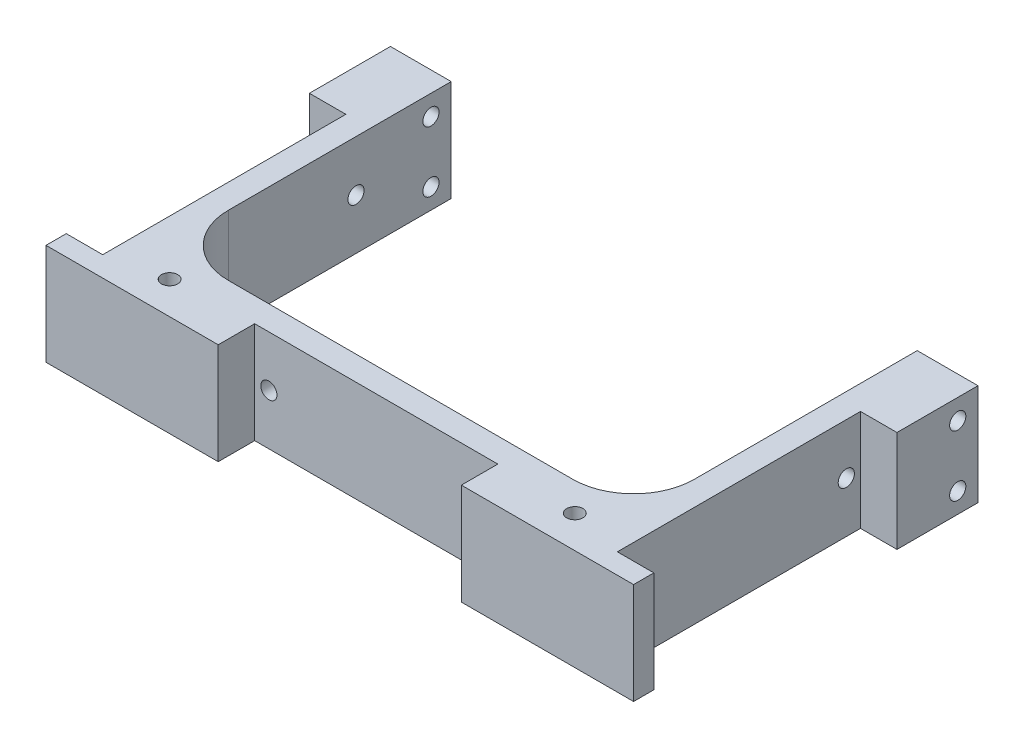
ISO-10303-21;
HEADER;
FILE_DESCRIPTION(('STEP AP214'),'2;1');
FILE_NAME('part.step','',(''),(''),'','','');
FILE_SCHEMA(('AUTOMOTIVE_DESIGN { 1 0 10303 214 1 1 1 1 }'));
ENDSEC;
DATA;
#1=APPLICATION_CONTEXT('core data for automotive mechanical design processes');
#2=APPLICATION_PROTOCOL_DEFINITION('international standard','automotive_design',2000,#1);
#3=PRODUCT_CONTEXT('',#1,'mechanical');
#4=PRODUCT('Part','Part','',(#3));
#5=PRODUCT_RELATED_PRODUCT_CATEGORY('part','',(#4));
#6=PRODUCT_DEFINITION_FORMATION('','',#4);
#7=PRODUCT_DEFINITION_CONTEXT('part definition',#1,'design');
#8=PRODUCT_DEFINITION('design','',#6,#7);
#9=PRODUCT_DEFINITION_SHAPE('','',#8);
#10=(LENGTH_UNIT() NAMED_UNIT(*) SI_UNIT(.MILLI.,.METRE.));
#11=(NAMED_UNIT(*) PLANE_ANGLE_UNIT() SI_UNIT($,.RADIAN.));
#12=(NAMED_UNIT(*) SI_UNIT($,.STERADIAN.) SOLID_ANGLE_UNIT());
#13=UNCERTAINTY_MEASURE_WITH_UNIT(LENGTH_MEASURE(1.E-05),#10,'distance_accuracy_value','');
#14=(GEOMETRIC_REPRESENTATION_CONTEXT(3) GLOBAL_UNCERTAINTY_ASSIGNED_CONTEXT((#13)) GLOBAL_UNIT_ASSIGNED_CONTEXT((#10,
#11,#12)) REPRESENTATION_CONTEXT('',''));
#15=CARTESIAN_POINT('',(0.,0.,0.));
#16=DIRECTION('',(0.,0.,1.));
#17=DIRECTION('',(1.,0.,0.));
#18=AXIS2_PLACEMENT_3D('',#15,#16,#17);
#19=CARTESIAN_POINT('',(63.5,25.,0.));
#20=DIRECTION('',(1.,0.,0.));
#21=DIRECTION('',(0.,0.,-1.));
#22=AXIS2_PLACEMENT_3D('',#19,#20,#21);
#23=PLANE('',#22);
#24=CARTESIAN_POINT('',(63.5,12.5,41.5));
#25=DIRECTION('',(1.,0.,0.));
#26=DIRECTION('',(0.,0.,-1.));
#27=AXIS2_PLACEMENT_3D('',#24,#25,#26);
#28=CIRCLE('',#27,2.);
#29=CARTESIAN_POINT('',(63.5,12.5,39.5));
#30=VERTEX_POINT('',#29);
#31=EDGE_CURVE('E597',#30,#30,#28,.T.);
#32=ORIENTED_EDGE('',*,*,#31,.F.);
#33=EDGE_LOOP('',(#32));
#34=FACE_BOUND('',#33,.T.);
#35=CARTESIAN_POINT('',(63.5,12.5,-11.5));
#36=DIRECTION('',(1.,0.,0.));
#37=DIRECTION('',(0.,0.,-1.));
#38=AXIS2_PLACEMENT_3D('',#35,#36,#37);
#39=CIRCLE('',#38,2.);
#40=CARTESIAN_POINT('',(63.5,12.5,-13.5));
#41=VERTEX_POINT('',#40);
#42=EDGE_CURVE('E594',#41,#41,#39,.T.);
#43=ORIENTED_EDGE('',*,*,#42,.F.);
#44=EDGE_LOOP('',(#43));
#45=FACE_BOUND('',#44,.T.);
#46=DIRECTION('',(0.,0.,1.));
#47=VECTOR('',#46,1.);
#48=CARTESIAN_POINT('',(63.5,0.,0.));
#49=LINE('',#48,#47);
#50=CARTESIAN_POINT('',(63.5,0.,-15.));
#51=VERTEX_POINT('',#50);
#52=CARTESIAN_POINT('',(63.5,0.,45.));
#53=VERTEX_POINT('',#52);
#54=EDGE_CURVE('E187',#51,#53,#49,.T.);
#55=ORIENTED_EDGE('',*,*,#54,.F.);
#56=DIRECTION('',(0.,-1.,0.));
#57=VECTOR('',#56,1.);
#58=CARTESIAN_POINT('',(63.5,25.,-15.));
#59=LINE('',#58,#57);
#60=CARTESIAN_POINT('',(63.5,25.,-15.));
#61=VERTEX_POINT('',#60);
#62=EDGE_CURVE('E183',#61,#51,#59,.T.);
#63=ORIENTED_EDGE('',*,*,#62,.F.);
#64=DIRECTION('',(0.,0.,1.));
#65=VECTOR('',#64,1.);
#66=CARTESIAN_POINT('',(63.5,25.,0.));
#67=LINE('',#66,#65);
#68=CARTESIAN_POINT('',(63.5,25.,45.));
#69=VERTEX_POINT('',#68);
#70=EDGE_CURVE('E185',#61,#69,#67,.T.);
#71=ORIENTED_EDGE('',*,*,#70,.T.);
#72=DIRECTION('',(0.,-1.,0.));
#73=VECTOR('',#72,1.);
#74=CARTESIAN_POINT('',(63.5,25.,45.));
#75=LINE('',#74,#73);
#76=EDGE_CURVE('E247',#69,#53,#75,.T.);
#77=ORIENTED_EDGE('',*,*,#76,.T.);
#78=EDGE_LOOP('',(#55,#63,#71,#77));
#79=FACE_BOUND('',#78,.T.);
#80=ADVANCED_FACE('F34',(#34,#45,#79),#23,.T.);
#81=CARTESIAN_POINT('',(0.,25.,-15.));
#82=DIRECTION('',(0.,0.,1.));
#83=DIRECTION('',(1.,0.,0.));
#84=AXIS2_PLACEMENT_3D('',#81,#82,#83);
#85=PLANE('',#84);
#86=DIRECTION('',(-1.,0.,0.));
#87=VECTOR('',#86,1.);
#88=CARTESIAN_POINT('',(0.,0.,-15.));
#89=LINE('',#88,#87);
#90=CARTESIAN_POINT('',(72.5,0.,-15.));
#91=VERTEX_POINT('',#90);
#92=EDGE_CURVE('E249',#91,#51,#89,.T.);
#93=ORIENTED_EDGE('',*,*,#92,.F.);
#94=DIRECTION('',(0.,-1.,0.));
#95=VECTOR('',#94,1.);
#96=CARTESIAN_POINT('',(72.5,25.,-15.));
#97=LINE('',#96,#95);
#98=CARTESIAN_POINT('',(72.5,25.,-15.));
#99=VERTEX_POINT('',#98);
#100=EDGE_CURVE('E193',#99,#91,#97,.T.);
#101=ORIENTED_EDGE('',*,*,#100,.F.);
#102=DIRECTION('',(-1.,0.,0.));
#103=VECTOR('',#102,1.);
#104=CARTESIAN_POINT('',(0.,25.,-15.));
#105=LINE('',#104,#103);
#106=EDGE_CURVE('E197',#99,#61,#105,.T.);
#107=ORIENTED_EDGE('',*,*,#106,.T.);
#108=ORIENTED_EDGE('',*,*,#62,.T.);
#109=EDGE_LOOP('',(#93,#101,#107,#108));
#110=FACE_BOUND('',#109,.T.);
#111=ADVANCED_FACE('F203',(#110),#85,.T.);
#112=CARTESIAN_POINT('',(72.5,25.,0.));
#113=DIRECTION('',(-1.,0.,0.));
#114=DIRECTION('',(0.,0.,1.));
#115=AXIS2_PLACEMENT_3D('',#112,#113,#114);
#116=PLANE('',#115);
#117=CARTESIAN_POINT('',(72.5,20.,-30.));
#118=DIRECTION('',(-1.,0.,0.));
#119=DIRECTION('',(0.,0.,1.));
#120=AXIS2_PLACEMENT_3D('',#117,#118,#119);
#121=CIRCLE('',#120,2.);
#122=CARTESIAN_POINT('',(72.5,20.,-28.));
#123=VERTEX_POINT('',#122);
#124=EDGE_CURVE('E571',#123,#123,#121,.T.);
#125=ORIENTED_EDGE('',*,*,#124,.T.);
#126=EDGE_LOOP('',(#125));
#127=FACE_BOUND('',#126,.T.);
#128=CARTESIAN_POINT('',(72.5,5.,-30.));
#129=DIRECTION('',(-1.,0.,0.));
#130=DIRECTION('',(0.,0.,1.));
#131=AXIS2_PLACEMENT_3D('',#128,#129,#130);
#132=CIRCLE('',#131,2.);
#133=CARTESIAN_POINT('',(72.5,5.,-28.));
#134=VERTEX_POINT('',#133);
#135=EDGE_CURVE('E578',#134,#134,#132,.T.);
#136=ORIENTED_EDGE('',*,*,#135,.T.);
#137=EDGE_LOOP('',(#136));
#138=FACE_BOUND('',#137,.T.);
#139=DIRECTION('',(0.,0.,-1.));
#140=VECTOR('',#139,1.);
#141=CARTESIAN_POINT('',(72.5,0.,0.));
#142=LINE('',#141,#140);
#143=CARTESIAN_POINT('',(72.5,0.,-35.));
#144=VERTEX_POINT('',#143);
#145=EDGE_CURVE('E252',#91,#144,#142,.T.);
#146=ORIENTED_EDGE('',*,*,#145,.T.);
#147=DIRECTION('',(0.,-1.,0.));
#148=VECTOR('',#147,1.);
#149=CARTESIAN_POINT('',(72.5,25.,-35.));
#150=LINE('',#149,#148);
#151=CARTESIAN_POINT('',(72.5,25.,-35.));
#152=VERTEX_POINT('',#151);
#153=EDGE_CURVE('E334',#152,#144,#150,.T.);
#154=ORIENTED_EDGE('',*,*,#153,.F.);
#155=DIRECTION('',(0.,0.,-1.));
#156=VECTOR('',#155,1.);
#157=CARTESIAN_POINT('',(72.5,25.,0.));
#158=LINE('',#157,#156);
#159=EDGE_CURVE('E205',#99,#152,#158,.T.);
#160=ORIENTED_EDGE('',*,*,#159,.F.);
#161=ORIENTED_EDGE('',*,*,#100,.T.);
#162=EDGE_LOOP('',(#146,#154,#160,#161));
#163=FACE_BOUND('',#162,.T.);
#164=ADVANCED_FACE('F427',(#127,#138,#163),#116,.F.);
#165=CARTESIAN_POINT('',(0.,25.,-35.));
#166=DIRECTION('',(0.,0.,-1.));
#167=DIRECTION('',(-1.,0.,0.));
#168=AXIS2_PLACEMENT_3D('',#165,#166,#167);
#169=PLANE('',#168);
#170=DIRECTION('',(1.,0.,0.));
#171=VECTOR('',#170,1.);
#172=CARTESIAN_POINT('',(0.,0.,-35.));
#173=LINE('',#172,#171);
#174=CARTESIAN_POINT('',(57.5,0.,-35.));
#175=VERTEX_POINT('',#174);
#176=EDGE_CURVE('E255',#175,#144,#173,.T.);
#177=ORIENTED_EDGE('',*,*,#176,.F.);
#178=DIRECTION('',(0.,-1.,0.));
#179=VECTOR('',#178,1.);
#180=CARTESIAN_POINT('',(57.5,25.,-35.));
#181=LINE('',#180,#179);
#182=CARTESIAN_POINT('',(57.5,25.,-35.));
#183=VERTEX_POINT('',#182);
#184=EDGE_CURVE('E331',#183,#175,#181,.T.);
#185=ORIENTED_EDGE('',*,*,#184,.F.);
#186=DIRECTION('',(1.,0.,0.));
#187=VECTOR('',#186,1.);
#188=CARTESIAN_POINT('',(0.,25.,-35.));
#189=LINE('',#188,#187);
#190=EDGE_CURVE('E207',#183,#152,#189,.T.);
#191=ORIENTED_EDGE('',*,*,#190,.T.);
#192=ORIENTED_EDGE('',*,*,#153,.T.);
#193=EDGE_LOOP('',(#177,#185,#191,#192));
#194=FACE_BOUND('',#193,.T.);
#195=ADVANCED_FACE('F433',(#194),#169,.T.);
#196=CARTESIAN_POINT('',(57.5,25.,0.));
#197=DIRECTION('',(-1.,0.,0.));
#198=DIRECTION('',(0.,0.,1.));
#199=AXIS2_PLACEMENT_3D('',#196,#197,#198);
#200=PLANE('',#199);
#201=CARTESIAN_POINT('',(57.5,20.,-30.));
#202=DIRECTION('',(-1.,0.,0.));
#203=DIRECTION('',(0.,0.,1.));
#204=AXIS2_PLACEMENT_3D('',#201,#202,#203);
#205=CIRCLE('',#204,2.);
#206=CARTESIAN_POINT('',(57.5,20.,-28.));
#207=VERTEX_POINT('',#206);
#208=EDGE_CURVE('E591',#207,#207,#205,.T.);
#209=ORIENTED_EDGE('',*,*,#208,.F.);
#210=EDGE_LOOP('',(#209));
#211=FACE_BOUND('',#210,.T.);
#212=CARTESIAN_POINT('',(57.5,5.,-30.));
#213=DIRECTION('',(-1.,0.,0.));
#214=DIRECTION('',(0.,0.,1.));
#215=AXIS2_PLACEMENT_3D('',#212,#213,#214);
#216=CIRCLE('',#215,2.);
#217=CARTESIAN_POINT('',(57.5,5.,-28.));
#218=VERTEX_POINT('',#217);
#219=EDGE_CURVE('E585',#218,#218,#216,.T.);
#220=ORIENTED_EDGE('',*,*,#219,.F.);
#221=EDGE_LOOP('',(#220));
#222=FACE_BOUND('',#221,.T.);
#223=CARTESIAN_POINT('',(57.5,12.5,-11.5));
#224=DIRECTION('',(-1.,0.,0.));
#225=DIRECTION('',(0.,0.,1.));
#226=AXIS2_PLACEMENT_3D('',#223,#224,#225);
#227=CIRCLE('',#226,2.);
#228=CARTESIAN_POINT('',(57.5,12.5,-9.49999999999999));
#229=VERTEX_POINT('',#228);
#230=EDGE_CURVE('E337',#229,#229,#227,.T.);
#231=ORIENTED_EDGE('',*,*,#230,.F.);
#232=EDGE_LOOP('',(#231));
#233=FACE_BOUND('',#232,.T.);
#234=DIRECTION('',(0.,0.,-1.));
#235=VECTOR('',#234,1.);
#236=CARTESIAN_POINT('',(57.5,0.,0.));
#237=LINE('',#236,#235);
#238=CARTESIAN_POINT('',(57.5,0.,20.));
#239=VERTEX_POINT('',#238);
#240=EDGE_CURVE('E258',#239,#175,#237,.T.);
#241=ORIENTED_EDGE('',*,*,#240,.F.);
#242=DIRECTION('',(0.,-1.,0.));
#243=VECTOR('',#242,1.);
#244=CARTESIAN_POINT('',(57.5,25.,20.));
#245=LINE('',#244,#243);
#246=CARTESIAN_POINT('',(57.5,25.,20.));
#247=VERTEX_POINT('',#246);
#248=EDGE_CURVE('E346',#239,#247,#245,.F.);
#249=ORIENTED_EDGE('',*,*,#248,.T.);
#250=DIRECTION('',(0.,0.,-1.));
#251=VECTOR('',#250,1.);
#252=CARTESIAN_POINT('',(57.5,25.,0.));
#253=LINE('',#252,#251);
#254=EDGE_CURVE('E213',#247,#183,#253,.T.);
#255=ORIENTED_EDGE('',*,*,#254,.T.);
#256=ORIENTED_EDGE('',*,*,#184,.T.);
#257=EDGE_LOOP('',(#241,#249,#255,#256));
#258=FACE_BOUND('',#257,.T.);
#259=ADVANCED_FACE('F436',(#211,#222,#233,#258),#200,.T.);
#260=CARTESIAN_POINT('',(0.,25.,35.));
#261=DIRECTION('',(0.,0.,-1.));
#262=DIRECTION('',(-1.,0.,0.));
#263=AXIS2_PLACEMENT_3D('',#260,#261,#262);
#264=PLANE('',#263);
#265=CARTESIAN_POINT('',(-26.5,12.5,35.));
#266=DIRECTION('',(0.,0.,-1.));
#267=DIRECTION('',(-1.,0.,0.));
#268=AXIS2_PLACEMENT_3D('',#265,#266,#267);
#269=CIRCLE('',#268,2.);
#270=CARTESIAN_POINT('',(-28.5,12.5,35.));
#271=VERTEX_POINT('',#270);
#272=EDGE_CURVE('E250',#271,#271,#269,.F.);
#273=ORIENTED_EDGE('',*,*,#272,.T.);
#274=EDGE_LOOP('',(#273));
#275=FACE_BOUND('',#274,.T.);
#276=CARTESIAN_POINT('',(26.5,12.5,35.));
#277=DIRECTION('',(0.,0.,-1.));
#278=DIRECTION('',(-1.,0.,0.));
#279=AXIS2_PLACEMENT_3D('',#276,#277,#278);
#280=CIRCLE('',#279,2.);
#281=CARTESIAN_POINT('',(24.5,12.5,35.));
#282=VERTEX_POINT('',#281);
#283=EDGE_CURVE('E617',#282,#282,#280,.F.);
#284=ORIENTED_EDGE('',*,*,#283,.T.);
#285=EDGE_LOOP('',(#284));
#286=FACE_BOUND('',#285,.T.);
#287=DIRECTION('',(1.,0.,0.));
#288=VECTOR('',#287,1.);
#289=CARTESIAN_POINT('',(0.,25.,35.));
#290=LINE('',#289,#288);
#291=CARTESIAN_POINT('',(-42.5,25.,35.));
#292=VERTEX_POINT('',#291);
#293=CARTESIAN_POINT('',(42.5,25.,35.));
#294=VERTEX_POINT('',#293);
#295=EDGE_CURVE('E215',#292,#294,#290,.T.);
#296=ORIENTED_EDGE('',*,*,#295,.T.);
#297=DIRECTION('',(0.,-1.,0.));
#298=VECTOR('',#297,1.);
#299=CARTESIAN_POINT('',(42.5,0.,35.));
#300=LINE('',#299,#298);
#301=CARTESIAN_POINT('',(42.5,0.,35.));
#302=VERTEX_POINT('',#301);
#303=EDGE_CURVE('E343',#294,#302,#300,.T.);
#304=ORIENTED_EDGE('',*,*,#303,.T.);
#305=DIRECTION('',(1.,0.,0.));
#306=VECTOR('',#305,1.);
#307=CARTESIAN_POINT('',(0.,0.,35.));
#308=LINE('',#307,#306);
#309=CARTESIAN_POINT('',(-42.5,0.,35.));
#310=VERTEX_POINT('',#309);
#311=EDGE_CURVE('E260',#310,#302,#308,.T.);
#312=ORIENTED_EDGE('',*,*,#311,.F.);
#313=DIRECTION('',(0.,-1.,0.));
#314=VECTOR('',#313,1.);
#315=CARTESIAN_POINT('',(-42.5,25.,35.));
#316=LINE('',#315,#314);
#317=EDGE_CURVE('E192',#310,#292,#316,.F.);
#318=ORIENTED_EDGE('',*,*,#317,.T.);
#319=EDGE_LOOP('',(#296,#304,#312,#318));
#320=FACE_BOUND('',#319,.T.);
#321=ADVANCED_FACE('F358',(#275,#286,#320),#264,.T.);
#322=CARTESIAN_POINT('',(-57.5,25.,0.));
#323=DIRECTION('',(1.,0.,0.));
#324=DIRECTION('',(0.,0.,-1.));
#325=AXIS2_PLACEMENT_3D('',#322,#323,#324);
#326=PLANE('',#325);
#327=CARTESIAN_POINT('',(-57.5,20.,-30.));
#328=DIRECTION('',(1.,0.,0.));
#329=DIRECTION('',(0.,0.,-1.));
#330=AXIS2_PLACEMENT_3D('',#327,#328,#329);
#331=CIRCLE('',#330,2.);
#332=CARTESIAN_POINT('',(-57.5,20.,-32.));
#333=VERTEX_POINT('',#332);
#334=EDGE_CURVE('E588',#333,#333,#331,.T.);
#335=ORIENTED_EDGE('',*,*,#334,.F.);
#336=EDGE_LOOP('',(#335));
#337=FACE_BOUND('',#336,.T.);
#338=CARTESIAN_POINT('',(-57.5,5.,-30.));
#339=DIRECTION('',(1.,0.,0.));
#340=DIRECTION('',(0.,0.,-1.));
#341=AXIS2_PLACEMENT_3D('',#338,#339,#340);
#342=CIRCLE('',#341,2.);
#343=CARTESIAN_POINT('',(-57.5,5.,-32.));
#344=VERTEX_POINT('',#343);
#345=EDGE_CURVE('E574',#344,#344,#342,.T.);
#346=ORIENTED_EDGE('',*,*,#345,.F.);
#347=EDGE_LOOP('',(#346));
#348=FACE_BOUND('',#347,.T.);
#349=CARTESIAN_POINT('',(-57.5,12.5,-11.5));
#350=DIRECTION('',(1.,0.,0.));
#351=DIRECTION('',(0.,0.,-1.));
#352=AXIS2_PLACEMENT_3D('',#349,#350,#351);
#353=CIRCLE('',#352,2.);
#354=CARTESIAN_POINT('',(-57.5,12.5,-13.5));
#355=VERTEX_POINT('',#354);
#356=EDGE_CURVE('E605',#355,#355,#353,.T.);
#357=ORIENTED_EDGE('',*,*,#356,.F.);
#358=EDGE_LOOP('',(#357));
#359=FACE_BOUND('',#358,.T.);
#360=DIRECTION('',(0.,0.,1.));
#361=VECTOR('',#360,1.);
#362=CARTESIAN_POINT('',(-57.5,25.,0.));
#363=LINE('',#362,#361);
#364=CARTESIAN_POINT('',(-57.5,25.,-35.));
#365=VERTEX_POINT('',#364);
#366=CARTESIAN_POINT('',(-57.5,25.,20.));
#367=VERTEX_POINT('',#366);
#368=EDGE_CURVE('E218',#365,#367,#363,.T.);
#369=ORIENTED_EDGE('',*,*,#368,.T.);
#370=DIRECTION('',(0.,-1.,0.));
#371=VECTOR('',#370,1.);
#372=CARTESIAN_POINT('',(-57.5,0.,20.));
#373=LINE('',#372,#371);
#374=CARTESIAN_POINT('',(-57.5,0.,20.));
#375=VERTEX_POINT('',#374);
#376=EDGE_CURVE('E348',#367,#375,#373,.T.);
#377=ORIENTED_EDGE('',*,*,#376,.T.);
#378=DIRECTION('',(0.,0.,1.));
#379=VECTOR('',#378,1.);
#380=CARTESIAN_POINT('',(-57.5,0.,0.));
#381=LINE('',#380,#379);
#382=CARTESIAN_POINT('',(-57.5,0.,-35.));
#383=VERTEX_POINT('',#382);
#384=EDGE_CURVE('E263',#383,#375,#381,.T.);
#385=ORIENTED_EDGE('',*,*,#384,.F.);
#386=DIRECTION('',(0.,-1.,0.));
#387=VECTOR('',#386,1.);
#388=CARTESIAN_POINT('',(-57.5,25.,-35.));
#389=LINE('',#388,#387);
#390=EDGE_CURVE('E329',#365,#383,#389,.T.);
#391=ORIENTED_EDGE('',*,*,#390,.F.);
#392=EDGE_LOOP('',(#369,#377,#385,#391));
#393=FACE_BOUND('',#392,.T.);
#394=ADVANCED_FACE('F361',(#337,#348,#359,#393),#326,.T.);
#395=CARTESIAN_POINT('',(0.,25.,-35.));
#396=DIRECTION('',(0.,0.,-1.));
#397=DIRECTION('',(-1.,0.,0.));
#398=AXIS2_PLACEMENT_3D('',#395,#396,#397);
#399=PLANE('',#398);
#400=DIRECTION('',(1.,0.,0.));
#401=VECTOR('',#400,1.);
#402=CARTESIAN_POINT('',(0.,0.,-35.));
#403=LINE('',#402,#401);
#404=CARTESIAN_POINT('',(-72.5,0.,-35.));
#405=VERTEX_POINT('',#404);
#406=EDGE_CURVE('E266',#405,#383,#403,.T.);
#407=ORIENTED_EDGE('',*,*,#406,.F.);
#408=DIRECTION('',(0.,-1.,0.));
#409=VECTOR('',#408,1.);
#410=CARTESIAN_POINT('',(-72.5,25.,-35.));
#411=LINE('',#410,#409);
#412=CARTESIAN_POINT('',(-72.5,25.,-35.));
#413=VERTEX_POINT('',#412);
#414=EDGE_CURVE('E327',#413,#405,#411,.T.);
#415=ORIENTED_EDGE('',*,*,#414,.F.);
#416=DIRECTION('',(1.,0.,0.));
#417=VECTOR('',#416,1.);
#418=CARTESIAN_POINT('',(0.,25.,-35.));
#419=LINE('',#418,#417);
#420=EDGE_CURVE('E220',#413,#365,#419,.T.);
#421=ORIENTED_EDGE('',*,*,#420,.T.);
#422=ORIENTED_EDGE('',*,*,#390,.T.);
#423=EDGE_LOOP('',(#407,#415,#421,#422));
#424=FACE_BOUND('',#423,.T.);
#425=ADVANCED_FACE('F365',(#424),#399,.T.);
#426=CARTESIAN_POINT('',(-72.5,25.,0.));
#427=DIRECTION('',(1.,0.,0.));
#428=DIRECTION('',(0.,0.,-1.));
#429=AXIS2_PLACEMENT_3D('',#426,#427,#428);
#430=PLANE('',#429);
#431=CARTESIAN_POINT('',(-72.5,20.,-30.));
#432=DIRECTION('',(-1.,0.,0.));
#433=DIRECTION('',(0.,0.,1.));
#434=AXIS2_PLACEMENT_3D('',#431,#432,#433);
#435=CIRCLE('',#434,2.);
#436=CARTESIAN_POINT('',(-72.5,20.,-28.));
#437=VERTEX_POINT('',#436);
#438=EDGE_CURVE('E575',#437,#437,#435,.T.);
#439=ORIENTED_EDGE('',*,*,#438,.F.);
#440=EDGE_LOOP('',(#439));
#441=FACE_BOUND('',#440,.T.);
#442=CARTESIAN_POINT('',(-72.5,5.,-30.));
#443=DIRECTION('',(-1.,0.,0.));
#444=DIRECTION('',(0.,0.,1.));
#445=AXIS2_PLACEMENT_3D('',#442,#443,#444);
#446=CIRCLE('',#445,2.);
#447=CARTESIAN_POINT('',(-72.5,5.,-28.));
#448=VERTEX_POINT('',#447);
#449=EDGE_CURVE('E563',#448,#448,#446,.T.);
#450=ORIENTED_EDGE('',*,*,#449,.F.);
#451=EDGE_LOOP('',(#450));
#452=FACE_BOUND('',#451,.T.);
#453=DIRECTION('',(0.,0.,1.));
#454=VECTOR('',#453,1.);
#455=CARTESIAN_POINT('',(-72.5,0.,0.));
#456=LINE('',#455,#454);
#457=CARTESIAN_POINT('',(-72.5,0.,-15.));
#458=VERTEX_POINT('',#457);
#459=EDGE_CURVE('E269',#405,#458,#456,.T.);
#460=ORIENTED_EDGE('',*,*,#459,.T.);
#461=DIRECTION('',(0.,-1.,0.));
#462=VECTOR('',#461,1.);
#463=CARTESIAN_POINT('',(-72.5,25.,-15.));
#464=LINE('',#463,#462);
#465=CARTESIAN_POINT('',(-72.5,25.,-15.));
#466=VERTEX_POINT('',#465);
#467=EDGE_CURVE('E324',#466,#458,#464,.T.);
#468=ORIENTED_EDGE('',*,*,#467,.F.);
#469=DIRECTION('',(0.,0.,1.));
#470=VECTOR('',#469,1.);
#471=CARTESIAN_POINT('',(-72.5,25.,0.));
#472=LINE('',#471,#470);
#473=EDGE_CURVE('E223',#413,#466,#472,.T.);
#474=ORIENTED_EDGE('',*,*,#473,.F.);
#475=ORIENTED_EDGE('',*,*,#414,.T.);
#476=EDGE_LOOP('',(#460,#468,#474,#475));
#477=FACE_BOUND('',#476,.T.);
#478=ADVANCED_FACE('F370',(#441,#452,#477),#430,.F.);
#479=CARTESIAN_POINT('',(0.,25.,-15.));
#480=DIRECTION('',(0.,0.,-1.));
#481=DIRECTION('',(-1.,0.,0.));
#482=AXIS2_PLACEMENT_3D('',#479,#480,#481);
#483=PLANE('',#482);
#484=DIRECTION('',(1.,0.,0.));
#485=VECTOR('',#484,1.);
#486=CARTESIAN_POINT('',(0.,0.,-15.));
#487=LINE('',#486,#485);
#488=CARTESIAN_POINT('',(-63.5,0.,-15.));
#489=VERTEX_POINT('',#488);
#490=EDGE_CURVE('E271',#458,#489,#487,.T.);
#491=ORIENTED_EDGE('',*,*,#490,.T.);
#492=DIRECTION('',(0.,-1.,0.));
#493=VECTOR('',#492,1.);
#494=CARTESIAN_POINT('',(-63.5,25.,-15.));
#495=LINE('',#494,#493);
#496=CARTESIAN_POINT('',(-63.5,25.,-15.));
#497=VERTEX_POINT('',#496);
#498=EDGE_CURVE('E321',#497,#489,#495,.T.);
#499=ORIENTED_EDGE('',*,*,#498,.F.);
#500=DIRECTION('',(1.,0.,0.));
#501=VECTOR('',#500,1.);
#502=CARTESIAN_POINT('',(0.,25.,-15.));
#503=LINE('',#502,#501);
#504=EDGE_CURVE('E225',#466,#497,#503,.T.);
#505=ORIENTED_EDGE('',*,*,#504,.F.);
#506=ORIENTED_EDGE('',*,*,#467,.T.);
#507=EDGE_LOOP('',(#491,#499,#505,#506));
#508=FACE_BOUND('',#507,.T.);
#509=ADVANCED_FACE('F377',(#508),#483,.F.);
#510=CARTESIAN_POINT('',(-63.5,25.,0.));
#511=DIRECTION('',(1.,0.,0.));
#512=DIRECTION('',(0.,0.,-1.));
#513=AXIS2_PLACEMENT_3D('',#510,#511,#512);
#514=PLANE('',#513);
#515=CARTESIAN_POINT('',(-63.5,12.5,-11.5));
#516=DIRECTION('',(-1.,0.,0.));
#517=DIRECTION('',(0.,0.,1.));
#518=AXIS2_PLACEMENT_3D('',#515,#516,#517);
#519=CIRCLE('',#518,2.);
#520=CARTESIAN_POINT('',(-63.5,12.5,-9.49999999999999));
#521=VERTEX_POINT('',#520);
#522=EDGE_CURVE('E602',#521,#521,#519,.T.);
#523=ORIENTED_EDGE('',*,*,#522,.F.);
#524=EDGE_LOOP('',(#523));
#525=FACE_BOUND('',#524,.T.);
#526=CARTESIAN_POINT('',(-63.5,12.5,41.5));
#527=DIRECTION('',(-1.,0.,0.));
#528=DIRECTION('',(0.,0.,1.));
#529=AXIS2_PLACEMENT_3D('',#526,#527,#528);
#530=CIRCLE('',#529,2.);
#531=CARTESIAN_POINT('',(-63.5,12.5,43.5));
#532=VERTEX_POINT('',#531);
#533=EDGE_CURVE('E340',#532,#532,#530,.T.);
#534=ORIENTED_EDGE('',*,*,#533,.F.);
#535=EDGE_LOOP('',(#534));
#536=FACE_BOUND('',#535,.T.);
#537=DIRECTION('',(0.,0.,1.));
#538=VECTOR('',#537,1.);
#539=CARTESIAN_POINT('',(-63.5,0.,0.));
#540=LINE('',#539,#538);
#541=CARTESIAN_POINT('',(-63.5,0.,45.));
#542=VERTEX_POINT('',#541);
#543=EDGE_CURVE('E273',#489,#542,#540,.T.);
#544=ORIENTED_EDGE('',*,*,#543,.T.);
#545=DIRECTION('',(0.,-1.,0.));
#546=VECTOR('',#545,1.);
#547=CARTESIAN_POINT('',(-63.5,25.,45.));
#548=LINE('',#547,#546);
#549=CARTESIAN_POINT('',(-63.5,25.,45.));
#550=VERTEX_POINT('',#549);
#551=EDGE_CURVE('E319',#550,#542,#548,.T.);
#552=ORIENTED_EDGE('',*,*,#551,.F.);
#553=DIRECTION('',(0.,0.,1.));
#554=VECTOR('',#553,1.);
#555=CARTESIAN_POINT('',(-63.5,25.,0.));
#556=LINE('',#555,#554);
#557=EDGE_CURVE('E227',#497,#550,#556,.T.);
#558=ORIENTED_EDGE('',*,*,#557,.F.);
#559=ORIENTED_EDGE('',*,*,#498,.T.);
#560=EDGE_LOOP('',(#544,#552,#558,#559));
#561=FACE_BOUND('',#560,.T.);
#562=ADVANCED_FACE('F381',(#525,#536,#561),#514,.F.);
#563=CARTESIAN_POINT('',(0.,25.,45.0000000000001));
#564=DIRECTION('',(0.,0.,-1.));
#565=DIRECTION('',(-1.,0.,0.));
#566=AXIS2_PLACEMENT_3D('',#563,#564,#565);
#567=PLANE('',#566);
#568=DIRECTION('',(1.,0.,0.));
#569=VECTOR('',#568,1.);
#570=CARTESIAN_POINT('',(0.,0.,45.0000000000001));
#571=LINE('',#570,#569);
#572=CARTESIAN_POINT('',(-72.5,0.,45.));
#573=VERTEX_POINT('',#572);
#574=EDGE_CURVE('E276',#573,#542,#571,.T.);
#575=ORIENTED_EDGE('',*,*,#574,.F.);
#576=DIRECTION('',(0.,-1.,0.));
#577=VECTOR('',#576,1.);
#578=CARTESIAN_POINT('',(-72.5,25.,45.));
#579=LINE('',#578,#577);
#580=CARTESIAN_POINT('',(-72.5,25.,45.));
#581=VERTEX_POINT('',#580);
#582=EDGE_CURVE('E317',#581,#573,#579,.T.);
#583=ORIENTED_EDGE('',*,*,#582,.F.);
#584=DIRECTION('',(1.,0.,0.));
#585=VECTOR('',#584,1.);
#586=CARTESIAN_POINT('',(0.,25.,45.0000000000001));
#587=LINE('',#586,#585);
#588=EDGE_CURVE('E229',#581,#550,#587,.T.);
#589=ORIENTED_EDGE('',*,*,#588,.T.);
#590=ORIENTED_EDGE('',*,*,#551,.T.);
#591=EDGE_LOOP('',(#575,#583,#589,#590));
#592=FACE_BOUND('',#591,.T.);
#593=ADVANCED_FACE('F384',(#592),#567,.T.);
#594=CARTESIAN_POINT('',(-72.5,25.,0.));
#595=DIRECTION('',(1.,0.,0.));
#596=DIRECTION('',(0.,0.,-1.));
#597=AXIS2_PLACEMENT_3D('',#594,#595,#596);
#598=PLANE('',#597);
#599=DIRECTION('',(0.,0.,1.));
#600=VECTOR('',#599,1.);
#601=CARTESIAN_POINT('',(-72.5,0.,0.));
#602=LINE('',#601,#600);
#603=CARTESIAN_POINT('',(-72.5,0.,50.));
#604=VERTEX_POINT('',#603);
#605=EDGE_CURVE('E279',#573,#604,#602,.T.);
#606=ORIENTED_EDGE('',*,*,#605,.T.);
#607=DIRECTION('',(0.,-1.,0.));
#608=VECTOR('',#607,1.);
#609=CARTESIAN_POINT('',(-72.5,25.,50.));
#610=LINE('',#609,#608);
#611=CARTESIAN_POINT('',(-72.5,25.,50.));
#612=VERTEX_POINT('',#611);
#613=EDGE_CURVE('E314',#612,#604,#610,.T.);
#614=ORIENTED_EDGE('',*,*,#613,.F.);
#615=DIRECTION('',(0.,0.,1.));
#616=VECTOR('',#615,1.);
#617=CARTESIAN_POINT('',(-72.5,25.,0.));
#618=LINE('',#617,#616);
#619=EDGE_CURVE('E232',#581,#612,#618,.T.);
#620=ORIENTED_EDGE('',*,*,#619,.F.);
#621=ORIENTED_EDGE('',*,*,#582,.T.);
#622=EDGE_LOOP('',(#606,#614,#620,#621));
#623=FACE_BOUND('',#622,.T.);
#624=ADVANCED_FACE('F390',(#623),#598,.F.);
#625=CARTESIAN_POINT('',(0.,25.,50.));
#626=DIRECTION('',(0.,0.,-1.));
#627=DIRECTION('',(-1.,0.,0.));
#628=AXIS2_PLACEMENT_3D('',#625,#626,#627);
#629=PLANE('',#628);
#630=DIRECTION('',(1.,0.,0.));
#631=VECTOR('',#630,1.);
#632=CARTESIAN_POINT('',(0.,0.,50.));
#633=LINE('',#632,#631);
#634=CARTESIAN_POINT('',(-30.0000000000001,0.,50.));
#635=VERTEX_POINT('',#634);
#636=EDGE_CURVE('E281',#604,#635,#633,.T.);
#637=ORIENTED_EDGE('',*,*,#636,.T.);
#638=DIRECTION('',(0.,-1.,0.));
#639=VECTOR('',#638,1.);
#640=CARTESIAN_POINT('',(-30.0000000000001,25.,50.));
#641=LINE('',#640,#639);
#642=CARTESIAN_POINT('',(-30.0000000000001,25.,50.));
#643=VERTEX_POINT('',#642);
#644=EDGE_CURVE('E311',#643,#635,#641,.T.);
#645=ORIENTED_EDGE('',*,*,#644,.F.);
#646=DIRECTION('',(1.,0.,0.));
#647=VECTOR('',#646,1.);
#648=CARTESIAN_POINT('',(0.,25.,50.));
#649=LINE('',#648,#647);
#650=EDGE_CURVE('E234',#612,#643,#649,.T.);
#651=ORIENTED_EDGE('',*,*,#650,.F.);
#652=ORIENTED_EDGE('',*,*,#613,.T.);
#653=EDGE_LOOP('',(#637,#645,#651,#652));
#654=FACE_BOUND('',#653,.T.);
#655=ADVANCED_FACE('F394',(#654),#629,.F.);
#656=CARTESIAN_POINT('',(-30.0000000000001,25.,0.));
#657=DIRECTION('',(-1.,0.,0.));
#658=DIRECTION('',(0.,0.,1.));
#659=AXIS2_PLACEMENT_3D('',#656,#657,#658);
#660=PLANE('',#659);
#661=DIRECTION('',(0.,0.,-1.));
#662=VECTOR('',#661,1.);
#663=CARTESIAN_POINT('',(-30.0000000000001,0.,0.));
#664=LINE('',#663,#662);
#665=CARTESIAN_POINT('',(-30.0000000000001,0.,41.));
#666=VERTEX_POINT('',#665);
#667=EDGE_CURVE('E283',#635,#666,#664,.T.);
#668=ORIENTED_EDGE('',*,*,#667,.T.);
#669=DIRECTION('',(0.,-1.,0.));
#670=VECTOR('',#669,1.);
#671=CARTESIAN_POINT('',(-30.0000000000001,25.,41.));
#672=LINE('',#671,#670);
#673=CARTESIAN_POINT('',(-30.0000000000001,25.,41.));
#674=VERTEX_POINT('',#673);
#675=EDGE_CURVE('E308',#674,#666,#672,.T.);
#676=ORIENTED_EDGE('',*,*,#675,.F.);
#677=DIRECTION('',(0.,0.,-1.));
#678=VECTOR('',#677,1.);
#679=CARTESIAN_POINT('',(-30.0000000000001,25.,0.));
#680=LINE('',#679,#678);
#681=EDGE_CURVE('E236',#643,#674,#680,.T.);
#682=ORIENTED_EDGE('',*,*,#681,.F.);
#683=ORIENTED_EDGE('',*,*,#644,.T.);
#684=EDGE_LOOP('',(#668,#676,#682,#683));
#685=FACE_BOUND('',#684,.T.);
#686=ADVANCED_FACE('F399',(#685),#660,.F.);
#687=CARTESIAN_POINT('',(0.,25.,41.));
#688=DIRECTION('',(0.,0.,-1.));
#689=DIRECTION('',(-1.,0.,0.));
#690=AXIS2_PLACEMENT_3D('',#687,#688,#689);
#691=PLANE('',#690);
#692=CARTESIAN_POINT('',(-26.5,12.5,41.));
#693=DIRECTION('',(0.,0.,1.));
#694=DIRECTION('',(1.,0.,0.));
#695=AXIS2_PLACEMENT_3D('',#692,#693,#694);
#696=CIRCLE('',#695,2.);
#697=CARTESIAN_POINT('',(-24.5,12.5,41.));
#698=VERTEX_POINT('',#697);
#699=EDGE_CURVE('E614',#698,#698,#696,.T.);
#700=ORIENTED_EDGE('',*,*,#699,.F.);
#701=EDGE_LOOP('',(#700));
#702=FACE_BOUND('',#701,.T.);
#703=CARTESIAN_POINT('',(26.5,12.5,41.));
#704=DIRECTION('',(0.,0.,1.));
#705=DIRECTION('',(1.,0.,0.));
#706=AXIS2_PLACEMENT_3D('',#703,#704,#705);
#707=CIRCLE('',#706,2.);
#708=CARTESIAN_POINT('',(28.5,12.5,41.));
#709=VERTEX_POINT('',#708);
#710=EDGE_CURVE('E613',#709,#709,#707,.T.);
#711=ORIENTED_EDGE('',*,*,#710,.F.);
#712=EDGE_LOOP('',(#711));
#713=FACE_BOUND('',#712,.T.);
#714=DIRECTION('',(1.,0.,0.));
#715=VECTOR('',#714,1.);
#716=CARTESIAN_POINT('',(0.,0.,41.));
#717=LINE('',#716,#715);
#718=CARTESIAN_POINT('',(29.9999999999999,0.,41.));
#719=VERTEX_POINT('',#718);
#720=EDGE_CURVE('E285',#666,#719,#717,.T.);
#721=ORIENTED_EDGE('',*,*,#720,.T.);
#722=DIRECTION('',(0.,-1.,0.));
#723=VECTOR('',#722,1.);
#724=CARTESIAN_POINT('',(29.9999999999999,25.,41.));
#725=LINE('',#724,#723);
#726=CARTESIAN_POINT('',(29.9999999999999,25.,41.));
#727=VERTEX_POINT('',#726);
#728=EDGE_CURVE('E305',#727,#719,#725,.T.);
#729=ORIENTED_EDGE('',*,*,#728,.F.);
#730=DIRECTION('',(1.,0.,0.));
#731=VECTOR('',#730,1.);
#732=CARTESIAN_POINT('',(0.,25.,41.));
#733=LINE('',#732,#731);
#734=EDGE_CURVE('E238',#674,#727,#733,.T.);
#735=ORIENTED_EDGE('',*,*,#734,.F.);
#736=ORIENTED_EDGE('',*,*,#675,.T.);
#737=EDGE_LOOP('',(#721,#729,#735,#736));
#738=FACE_BOUND('',#737,.T.);
#739=ADVANCED_FACE('F405',(#702,#713,#738),#691,.F.);
#740=CARTESIAN_POINT('',(29.9999999999991,25.,-5.78241158658919E-13));
#741=DIRECTION('',(1.,0.,0.));
#742=DIRECTION('',(0.,0.,-1.));
#743=AXIS2_PLACEMENT_3D('',#740,#741,#742);
#744=PLANE('',#743);
#745=DIRECTION('',(0.,0.,1.));
#746=VECTOR('',#745,1.);
#747=CARTESIAN_POINT('',(29.9999999999991,0.,-5.78241158658919E-13));
#748=LINE('',#747,#746);
#749=CARTESIAN_POINT('',(30.0000000000001,0.,50.));
#750=VERTEX_POINT('',#749);
#751=EDGE_CURVE('E287',#719,#750,#748,.T.);
#752=ORIENTED_EDGE('',*,*,#751,.T.);
#753=DIRECTION('',(0.,-1.,0.));
#754=VECTOR('',#753,1.);
#755=CARTESIAN_POINT('',(30.0000000000001,25.,50.));
#756=LINE('',#755,#754);
#757=CARTESIAN_POINT('',(30.0000000000001,25.,50.));
#758=VERTEX_POINT('',#757);
#759=EDGE_CURVE('E302',#758,#750,#756,.T.);
#760=ORIENTED_EDGE('',*,*,#759,.F.);
#761=DIRECTION('',(0.,0.,1.));
#762=VECTOR('',#761,1.);
#763=CARTESIAN_POINT('',(29.9999999999991,25.,-5.78241158658919E-13));
#764=LINE('',#763,#762);
#765=EDGE_CURVE('E240',#727,#758,#764,.T.);
#766=ORIENTED_EDGE('',*,*,#765,.F.);
#767=ORIENTED_EDGE('',*,*,#728,.T.);
#768=EDGE_LOOP('',(#752,#760,#766,#767));
#769=FACE_BOUND('',#768,.T.);
#770=ADVANCED_FACE('F409',(#769),#744,.F.);
#771=CARTESIAN_POINT('',(0.,25.,50.));
#772=DIRECTION('',(0.,0.,-1.));
#773=DIRECTION('',(-1.,0.,0.));
#774=AXIS2_PLACEMENT_3D('',#771,#772,#773);
#775=PLANE('',#774);
#776=DIRECTION('',(1.,0.,0.));
#777=VECTOR('',#776,1.);
#778=CARTESIAN_POINT('',(0.,0.,50.));
#779=LINE('',#778,#777);
#780=CARTESIAN_POINT('',(72.5,0.,50.));
#781=VERTEX_POINT('',#780);
#782=EDGE_CURVE('E289',#750,#781,#779,.T.);
#783=ORIENTED_EDGE('',*,*,#782,.T.);
#784=DIRECTION('',(0.,-1.,0.));
#785=VECTOR('',#784,1.);
#786=CARTESIAN_POINT('',(72.5,25.,50.));
#787=LINE('',#786,#785);
#788=CARTESIAN_POINT('',(72.5,25.,50.));
#789=VERTEX_POINT('',#788);
#790=EDGE_CURVE('E299',#789,#781,#787,.T.);
#791=ORIENTED_EDGE('',*,*,#790,.F.);
#792=DIRECTION('',(1.,0.,0.));
#793=VECTOR('',#792,1.);
#794=CARTESIAN_POINT('',(0.,25.,50.));
#795=LINE('',#794,#793);
#796=EDGE_CURVE('E242',#758,#789,#795,.T.);
#797=ORIENTED_EDGE('',*,*,#796,.F.);
#798=ORIENTED_EDGE('',*,*,#759,.T.);
#799=EDGE_LOOP('',(#783,#791,#797,#798));
#800=FACE_BOUND('',#799,.T.);
#801=ADVANCED_FACE('F414',(#800),#775,.F.);
#802=CARTESIAN_POINT('',(72.5,25.,0.));
#803=DIRECTION('',(-1.,0.,0.));
#804=DIRECTION('',(0.,0.,1.));
#805=AXIS2_PLACEMENT_3D('',#802,#803,#804);
#806=PLANE('',#805);
#807=DIRECTION('',(0.,0.,-1.));
#808=VECTOR('',#807,1.);
#809=CARTESIAN_POINT('',(72.5,0.,0.));
#810=LINE('',#809,#808);
#811=CARTESIAN_POINT('',(72.5,0.,45.));
#812=VERTEX_POINT('',#811);
#813=EDGE_CURVE('E291',#781,#812,#810,.T.);
#814=ORIENTED_EDGE('',*,*,#813,.T.);
#815=DIRECTION('',(0.,-1.,0.));
#816=VECTOR('',#815,1.);
#817=CARTESIAN_POINT('',(72.5,25.,45.));
#818=LINE('',#817,#816);
#819=CARTESIAN_POINT('',(72.5,25.,45.));
#820=VERTEX_POINT('',#819);
#821=EDGE_CURVE('E296',#820,#812,#818,.T.);
#822=ORIENTED_EDGE('',*,*,#821,.F.);
#823=DIRECTION('',(0.,0.,-1.));
#824=VECTOR('',#823,1.);
#825=CARTESIAN_POINT('',(72.5,25.,0.));
#826=LINE('',#825,#824);
#827=EDGE_CURVE('E244',#789,#820,#826,.T.);
#828=ORIENTED_EDGE('',*,*,#827,.F.);
#829=ORIENTED_EDGE('',*,*,#790,.T.);
#830=EDGE_LOOP('',(#814,#822,#828,#829));
#831=FACE_BOUND('',#830,.T.);
#832=ADVANCED_FACE('F418',(#831),#806,.F.);
#833=CARTESIAN_POINT('',(0.,25.,45.0000000000001));
#834=DIRECTION('',(0.,0.,1.));
#835=DIRECTION('',(1.,0.,0.));
#836=AXIS2_PLACEMENT_3D('',#833,#834,#835);
#837=PLANE('',#836);
#838=DIRECTION('',(-1.,0.,0.));
#839=VECTOR('',#838,1.);
#840=CARTESIAN_POINT('',(0.,0.,45.0000000000001));
#841=LINE('',#840,#839);
#842=EDGE_CURVE('E201',#812,#53,#841,.T.);
#843=ORIENTED_EDGE('',*,*,#842,.T.);
#844=ORIENTED_EDGE('',*,*,#76,.F.);
#845=DIRECTION('',(-1.,0.,0.));
#846=VECTOR('',#845,1.);
#847=CARTESIAN_POINT('',(0.,25.,45.0000000000001));
#848=LINE('',#847,#846);
#849=EDGE_CURVE('E199',#820,#69,#848,.T.);
#850=ORIENTED_EDGE('',*,*,#849,.F.);
#851=ORIENTED_EDGE('',*,*,#821,.T.);
#852=EDGE_LOOP('',(#843,#844,#850,#851));
#853=FACE_BOUND('',#852,.T.);
#854=ADVANCED_FACE('F422',(#853),#837,.F.);
#855=CARTESIAN_POINT('',(0.,25.,0.));
#856=DIRECTION('',(0.,1.,0.));
#857=DIRECTION('',(0.,0.,1.));
#858=AXIS2_PLACEMENT_3D('',#855,#856,#857);
#859=PLANE('',#858);
#860=CARTESIAN_POINT('',(50.,25.,42.));
#861=DIRECTION('',(0.,1.,0.));
#862=DIRECTION('',(0.,0.,1.));
#863=AXIS2_PLACEMENT_3D('',#860,#861,#862);
#864=CIRCLE('',#863,2.);
#865=CARTESIAN_POINT('',(50.,25.,44.));
#866=VERTEX_POINT('',#865);
#867=EDGE_CURVE('E560',#866,#866,#864,.T.);
#868=ORIENTED_EDGE('',*,*,#867,.F.);
#869=EDGE_LOOP('',(#868));
#870=FACE_BOUND('',#869,.T.);
#871=CARTESIAN_POINT('',(-50.,25.,42.));
#872=DIRECTION('',(0.,1.,0.));
#873=DIRECTION('',(0.,0.,1.));
#874=AXIS2_PLACEMENT_3D('',#871,#872,#873);
#875=CIRCLE('',#874,2.);
#876=CARTESIAN_POINT('',(-50.,25.,44.));
#877=VERTEX_POINT('',#876);
#878=EDGE_CURVE('E566',#877,#877,#875,.T.);
#879=ORIENTED_EDGE('',*,*,#878,.F.);
#880=EDGE_LOOP('',(#879));
#881=FACE_BOUND('',#880,.T.);
#882=ORIENTED_EDGE('',*,*,#70,.F.);
#883=ORIENTED_EDGE('',*,*,#106,.F.);
#884=ORIENTED_EDGE('',*,*,#159,.T.);
#885=ORIENTED_EDGE('',*,*,#190,.F.);
#886=ORIENTED_EDGE('',*,*,#254,.F.);
#887=CARTESIAN_POINT('',(42.5,25.,20.));
#888=DIRECTION('',(0.,1.,0.));
#889=DIRECTION('',(0.,0.,1.));
#890=AXIS2_PLACEMENT_3D('',#887,#888,#889);
#891=CIRCLE('',#890,15.);
#892=EDGE_CURVE('E352',#247,#294,#891,.F.);
#893=ORIENTED_EDGE('',*,*,#892,.T.);
#894=ORIENTED_EDGE('',*,*,#295,.F.);
#895=CARTESIAN_POINT('',(-42.5,25.,20.));
#896=DIRECTION('',(0.,1.,0.));
#897=DIRECTION('',(0.,0.,1.));
#898=AXIS2_PLACEMENT_3D('',#895,#896,#897);
#899=CIRCLE('',#898,15.);
#900=EDGE_CURVE('E11',#292,#367,#899,.F.);
#901=ORIENTED_EDGE('',*,*,#900,.T.);
#902=ORIENTED_EDGE('',*,*,#368,.F.);
#903=ORIENTED_EDGE('',*,*,#420,.F.);
#904=ORIENTED_EDGE('',*,*,#473,.T.);
#905=ORIENTED_EDGE('',*,*,#504,.T.);
#906=ORIENTED_EDGE('',*,*,#557,.T.);
#907=ORIENTED_EDGE('',*,*,#588,.F.);
#908=ORIENTED_EDGE('',*,*,#619,.T.);
#909=ORIENTED_EDGE('',*,*,#650,.T.);
#910=ORIENTED_EDGE('',*,*,#681,.T.);
#911=ORIENTED_EDGE('',*,*,#734,.T.);
#912=ORIENTED_EDGE('',*,*,#765,.T.);
#913=ORIENTED_EDGE('',*,*,#796,.T.);
#914=ORIENTED_EDGE('',*,*,#827,.T.);
#915=ORIENTED_EDGE('',*,*,#849,.T.);
#916=EDGE_LOOP('',(#882,#883,#884,#885,#886,#893,#894,#901,#902,#903,#904,#905,#906,#907,#908,
#909,#910,#911,#912,#913,#914,#915));
#917=FACE_BOUND('',#916,.T.);
#918=ADVANCED_FACE('F196',(#870,#881,#917),#859,.T.);
#919=CARTESIAN_POINT('',(0.,0.,0.));
#920=DIRECTION('',(0.,1.,0.));
#921=DIRECTION('',(0.,0.,1.));
#922=AXIS2_PLACEMENT_3D('',#919,#920,#921);
#923=PLANE('',#922);
#924=CARTESIAN_POINT('',(50.,0.,42.));
#925=DIRECTION('',(0.,1.,0.));
#926=DIRECTION('',(0.,0.,1.));
#927=AXIS2_PLACEMENT_3D('',#924,#925,#926);
#928=CIRCLE('',#927,2.);
#929=CARTESIAN_POINT('',(50.,0.,44.));
#930=VERTEX_POINT('',#929);
#931=EDGE_CURVE('E557',#930,#930,#928,.T.);
#932=ORIENTED_EDGE('',*,*,#931,.T.);
#933=EDGE_LOOP('',(#932));
#934=FACE_BOUND('',#933,.T.);
#935=CARTESIAN_POINT('',(-50.,0.,42.));
#936=DIRECTION('',(0.,1.,0.));
#937=DIRECTION('',(0.,0.,1.));
#938=AXIS2_PLACEMENT_3D('',#935,#936,#937);
#939=CIRCLE('',#938,2.);
#940=CARTESIAN_POINT('',(-50.,0.,44.));
#941=VERTEX_POINT('',#940);
#942=EDGE_CURVE('E561',#941,#941,#939,.T.);
#943=ORIENTED_EDGE('',*,*,#942,.T.);
#944=EDGE_LOOP('',(#943));
#945=FACE_BOUND('',#944,.T.);
#946=ORIENTED_EDGE('',*,*,#54,.T.);
#947=ORIENTED_EDGE('',*,*,#842,.F.);
#948=ORIENTED_EDGE('',*,*,#813,.F.);
#949=ORIENTED_EDGE('',*,*,#782,.F.);
#950=ORIENTED_EDGE('',*,*,#751,.F.);
#951=ORIENTED_EDGE('',*,*,#720,.F.);
#952=ORIENTED_EDGE('',*,*,#667,.F.);
#953=ORIENTED_EDGE('',*,*,#636,.F.);
#954=ORIENTED_EDGE('',*,*,#605,.F.);
#955=ORIENTED_EDGE('',*,*,#574,.T.);
#956=ORIENTED_EDGE('',*,*,#543,.F.);
#957=ORIENTED_EDGE('',*,*,#490,.F.);
#958=ORIENTED_EDGE('',*,*,#459,.F.);
#959=ORIENTED_EDGE('',*,*,#406,.T.);
#960=ORIENTED_EDGE('',*,*,#384,.T.);
#961=CARTESIAN_POINT('',(-42.5,0.,20.));
#962=DIRECTION('',(0.,1.,0.));
#963=DIRECTION('',(0.,0.,1.));
#964=AXIS2_PLACEMENT_3D('',#961,#962,#963);
#965=CIRCLE('',#964,15.);
#966=EDGE_CURVE('E42',#375,#310,#965,.T.);
#967=ORIENTED_EDGE('',*,*,#966,.T.);
#968=ORIENTED_EDGE('',*,*,#311,.T.);
#969=CARTESIAN_POINT('',(42.5,0.,20.));
#970=DIRECTION('',(0.,1.,0.));
#971=DIRECTION('',(0.,0.,1.));
#972=AXIS2_PLACEMENT_3D('',#969,#970,#971);
#973=CIRCLE('',#972,15.);
#974=EDGE_CURVE('E350',#302,#239,#973,.T.);
#975=ORIENTED_EDGE('',*,*,#974,.T.);
#976=ORIENTED_EDGE('',*,*,#240,.T.);
#977=ORIENTED_EDGE('',*,*,#176,.T.);
#978=ORIENTED_EDGE('',*,*,#145,.F.);
#979=ORIENTED_EDGE('',*,*,#92,.T.);
#980=EDGE_LOOP('',(#946,#947,#948,#949,#950,#951,#952,#953,#954,#955,#956,#957,#958,#959,#960,
#967,#968,#975,#976,#977,#978,#979));
#981=FACE_BOUND('',#980,.T.);
#982=ADVANCED_FACE('F355',(#934,#945,#981),#923,.F.);
#983=CARTESIAN_POINT('',(26.5,12.5,29.3431457505076));
#984=DIRECTION('',(0.,0.,1.));
#985=DIRECTION('',(1.,0.,0.));
#986=AXIS2_PLACEMENT_3D('',#983,#984,#985);
#987=CYLINDRICAL_SURFACE('',#986,2.);
#988=ORIENTED_EDGE('',*,*,#710,.T.);
#989=EDGE_LOOP('',(#988));
#990=FACE_BOUND('',#989,.T.);
#991=ORIENTED_EDGE('',*,*,#283,.F.);
#992=EDGE_LOOP('',(#991));
#993=FACE_BOUND('',#992,.T.);
#994=ADVANCED_FACE('F505',(#990,#993),#987,.F.);
#995=CARTESIAN_POINT('',(-26.5,12.5,29.3431457505076));
#996=DIRECTION('',(0.,0.,1.));
#997=DIRECTION('',(1.,0.,0.));
#998=AXIS2_PLACEMENT_3D('',#995,#996,#997);
#999=CYLINDRICAL_SURFACE('',#998,2.);
#1000=ORIENTED_EDGE('',*,*,#699,.T.);
#1001=EDGE_LOOP('',(#1000));
#1002=FACE_BOUND('',#1001,.T.);
#1003=ORIENTED_EDGE('',*,*,#272,.F.);
#1004=EDGE_LOOP('',(#1003));
#1005=FACE_BOUND('',#1004,.T.);
#1006=ADVANCED_FACE('F512',(#1002,#1005),#999,.F.);
#1007=CARTESIAN_POINT('',(-56.5,12.5,41.5));
#1008=DIRECTION('',(-1.,0.,0.));
#1009=DIRECTION('',(0.,0.,1.));
#1010=AXIS2_PLACEMENT_3D('',#1007,#1008,#1009);
#1011=CYLINDRICAL_SURFACE('',#1010,2.);
#1012=CARTESIAN_POINT('',(-56.5,12.5,41.5));
#1013=DIRECTION('',(-1.,0.,0.));
#1014=DIRECTION('',(0.,0.,1.));
#1015=AXIS2_PLACEMENT_3D('',#1012,#1013,#1014);
#1016=CIRCLE('',#1015,2.);
#1017=CARTESIAN_POINT('',(-56.5,12.5,43.5));
#1018=VERTEX_POINT('',#1017);
#1019=EDGE_CURVE('E606',#1018,#1018,#1016,.T.);
#1020=ORIENTED_EDGE('',*,*,#1019,.F.);
#1021=EDGE_LOOP('',(#1020));
#1022=FACE_BOUND('',#1021,.T.);
#1023=ORIENTED_EDGE('',*,*,#533,.T.);
#1024=EDGE_LOOP('',(#1023));
#1025=FACE_BOUND('',#1024,.T.);
#1026=ADVANCED_FACE('F516',(#1022,#1025),#1011,.F.);
#1027=CARTESIAN_POINT('',(-56.5,12.5,41.5));
#1028=DIRECTION('',(-1.,0.,0.));
#1029=DIRECTION('',(0.,0.,1.));
#1030=AXIS2_PLACEMENT_3D('',#1027,#1028,#1029);
#1031=PLANE('',#1030);
#1032=ORIENTED_EDGE('',*,*,#1019,.T.);
#1033=EDGE_LOOP('',(#1032));
#1034=FACE_BOUND('',#1033,.T.);
#1035=ADVANCED_FACE('F520',(#1034),#1031,.T.);
#1036=CARTESIAN_POINT('',(-56.5,12.5,-11.5));
#1037=DIRECTION('',(-1.,0.,0.));
#1038=DIRECTION('',(0.,0.,1.));
#1039=AXIS2_PLACEMENT_3D('',#1036,#1037,#1038);
#1040=CYLINDRICAL_SURFACE('',#1039,2.);
#1041=ORIENTED_EDGE('',*,*,#356,.T.);
#1042=EDGE_LOOP('',(#1041));
#1043=FACE_BOUND('',#1042,.T.);
#1044=ORIENTED_EDGE('',*,*,#522,.T.);
#1045=EDGE_LOOP('',(#1044));
#1046=FACE_BOUND('',#1045,.T.);
#1047=ADVANCED_FACE('F524',(#1043,#1046),#1040,.F.);
#1048=CARTESIAN_POINT('',(56.5,12.5,-11.5));
#1049=DIRECTION('',(1.,0.,0.));
#1050=DIRECTION('',(0.,0.,-1.));
#1051=AXIS2_PLACEMENT_3D('',#1048,#1049,#1050);
#1052=CYLINDRICAL_SURFACE('',#1051,2.);
#1053=ORIENTED_EDGE('',*,*,#230,.T.);
#1054=EDGE_LOOP('',(#1053));
#1055=FACE_BOUND('',#1054,.T.);
#1056=ORIENTED_EDGE('',*,*,#42,.T.);
#1057=EDGE_LOOP('',(#1056));
#1058=FACE_BOUND('',#1057,.T.);
#1059=ADVANCED_FACE('F528',(#1055,#1058),#1052,.F.);
#1060=CARTESIAN_POINT('',(56.5,12.5,41.5));
#1061=DIRECTION('',(1.,0.,0.));
#1062=DIRECTION('',(0.,0.,-1.));
#1063=AXIS2_PLACEMENT_3D('',#1060,#1061,#1062);
#1064=CYLINDRICAL_SURFACE('',#1063,2.);
#1065=CARTESIAN_POINT('',(56.5,12.5,41.5));
#1066=DIRECTION('',(1.,0.,0.));
#1067=DIRECTION('',(0.,0.,-1.));
#1068=AXIS2_PLACEMENT_3D('',#1065,#1066,#1067);
#1069=CIRCLE('',#1068,2.);
#1070=CARTESIAN_POINT('',(56.5,12.5,39.5));
#1071=VERTEX_POINT('',#1070);
#1072=EDGE_CURVE('E341',#1071,#1071,#1069,.T.);
#1073=ORIENTED_EDGE('',*,*,#1072,.F.);
#1074=EDGE_LOOP('',(#1073));
#1075=FACE_BOUND('',#1074,.T.);
#1076=ORIENTED_EDGE('',*,*,#31,.T.);
#1077=EDGE_LOOP('',(#1076));
#1078=FACE_BOUND('',#1077,.T.);
#1079=ADVANCED_FACE('F447',(#1075,#1078),#1064,.F.);
#1080=CARTESIAN_POINT('',(56.5,12.5,41.5));
#1081=DIRECTION('',(1.,0.,0.));
#1082=DIRECTION('',(0.,0.,-1.));
#1083=AXIS2_PLACEMENT_3D('',#1080,#1081,#1082);
#1084=PLANE('',#1083);
#1085=ORIENTED_EDGE('',*,*,#1072,.T.);
#1086=EDGE_LOOP('',(#1085));
#1087=FACE_BOUND('',#1086,.T.);
#1088=ADVANCED_FACE('F441',(#1087),#1084,.T.);
#1089=CARTESIAN_POINT('',(42.5,25.,20.));
#1090=DIRECTION('',(0.,1.,0.));
#1091=DIRECTION('',(0.,0.,1.));
#1092=AXIS2_PLACEMENT_3D('',#1089,#1090,#1091);
#1093=CYLINDRICAL_SURFACE('',#1092,15.);
#1094=ORIENTED_EDGE('',*,*,#892,.F.);
#1095=ORIENTED_EDGE('',*,*,#248,.F.);
#1096=ORIENTED_EDGE('',*,*,#974,.F.);
#1097=ORIENTED_EDGE('',*,*,#303,.F.);
#1098=EDGE_LOOP('',(#1094,#1095,#1096,#1097));
#1099=FACE_BOUND('',#1098,.T.);
#1100=ADVANCED_FACE('F439',(#1099),#1093,.F.);
#1101=CARTESIAN_POINT('',(-42.5,25.,20.));
#1102=DIRECTION('',(0.,1.,0.));
#1103=DIRECTION('',(0.,0.,1.));
#1104=AXIS2_PLACEMENT_3D('',#1101,#1102,#1103);
#1105=CYLINDRICAL_SURFACE('',#1104,15.);
#1106=ORIENTED_EDGE('',*,*,#900,.F.);
#1107=ORIENTED_EDGE('',*,*,#317,.F.);
#1108=ORIENTED_EDGE('',*,*,#966,.F.);
#1109=ORIENTED_EDGE('',*,*,#376,.F.);
#1110=EDGE_LOOP('',(#1106,#1107,#1108,#1109));
#1111=FACE_BOUND('',#1110,.T.);
#1112=ADVANCED_FACE('F36',(#1111),#1105,.F.);
#1113=CARTESIAN_POINT('',(72.5,5.,-30.));
#1114=DIRECTION('',(-1.,0.,0.));
#1115=DIRECTION('',(0.,0.,1.));
#1116=AXIS2_PLACEMENT_3D('',#1113,#1114,#1115);
#1117=CYLINDRICAL_SURFACE('',#1116,2.);
#1118=ORIENTED_EDGE('',*,*,#345,.T.);
#1119=EDGE_LOOP('',(#1118));
#1120=FACE_BOUND('',#1119,.T.);
#1121=ORIENTED_EDGE('',*,*,#449,.T.);
#1122=EDGE_LOOP('',(#1121));
#1123=FACE_BOUND('',#1122,.T.);
#1124=ADVANCED_FACE('F446',(#1120,#1123),#1117,.F.);
#1125=CARTESIAN_POINT('',(72.5,20.,-30.));
#1126=DIRECTION('',(-1.,0.,0.));
#1127=DIRECTION('',(0.,0.,1.));
#1128=AXIS2_PLACEMENT_3D('',#1125,#1126,#1127);
#1129=CYLINDRICAL_SURFACE('',#1128,2.);
#1130=ORIENTED_EDGE('',*,*,#334,.T.);
#1131=EDGE_LOOP('',(#1130));
#1132=FACE_BOUND('',#1131,.T.);
#1133=ORIENTED_EDGE('',*,*,#438,.T.);
#1134=EDGE_LOOP('',(#1133));
#1135=FACE_BOUND('',#1134,.T.);
#1136=ADVANCED_FACE('F538',(#1132,#1135),#1129,.F.);
#1137=ORIENTED_EDGE('',*,*,#219,.T.);
#1138=EDGE_LOOP('',(#1137));
#1139=FACE_BOUND('',#1138,.T.);
#1140=ORIENTED_EDGE('',*,*,#135,.F.);
#1141=EDGE_LOOP('',(#1140));
#1142=FACE_BOUND('',#1141,.T.);
#1143=ADVANCED_FACE('F540',(#1139,#1142),#1117,.F.);
#1144=ORIENTED_EDGE('',*,*,#208,.T.);
#1145=EDGE_LOOP('',(#1144));
#1146=FACE_BOUND('',#1145,.T.);
#1147=ORIENTED_EDGE('',*,*,#124,.F.);
#1148=EDGE_LOOP('',(#1147));
#1149=FACE_BOUND('',#1148,.T.);
#1150=ADVANCED_FACE('F544',(#1146,#1149),#1129,.F.);
#1151=CARTESIAN_POINT('',(-50.,0.,42.));
#1152=DIRECTION('',(0.,1.,0.));
#1153=DIRECTION('',(0.,0.,1.));
#1154=AXIS2_PLACEMENT_3D('',#1151,#1152,#1153);
#1155=CYLINDRICAL_SURFACE('',#1154,2.);
#1156=ORIENTED_EDGE('',*,*,#942,.F.);
#1157=EDGE_LOOP('',(#1156));
#1158=FACE_BOUND('',#1157,.T.);
#1159=ORIENTED_EDGE('',*,*,#878,.T.);
#1160=EDGE_LOOP('',(#1159));
#1161=FACE_BOUND('',#1160,.T.);
#1162=ADVANCED_FACE('F545',(#1158,#1161),#1155,.F.);
#1163=CARTESIAN_POINT('',(50.,0.,42.));
#1164=DIRECTION('',(0.,1.,0.));
#1165=DIRECTION('',(0.,0.,1.));
#1166=AXIS2_PLACEMENT_3D('',#1163,#1164,#1165);
#1167=CYLINDRICAL_SURFACE('',#1166,2.);
#1168=ORIENTED_EDGE('',*,*,#931,.F.);
#1169=EDGE_LOOP('',(#1168));
#1170=FACE_BOUND('',#1169,.T.);
#1171=ORIENTED_EDGE('',*,*,#867,.T.);
#1172=EDGE_LOOP('',(#1171));
#1173=FACE_BOUND('',#1172,.T.);
#1174=ADVANCED_FACE('F548',(#1170,#1173),#1167,.F.);
#1175=CLOSED_SHELL('',(#80,#111,#164,#195,#259,#321,#394,#425,#478,#509,#562,#593,#624,#655,
#686,#739,#770,#801,#832,#854,#918,#982,#994,#1006,#1026,#1035,#1047,#1059,#1079,#1088,#1100,
#1112,#1124,#1136,#1143,#1150,#1162,#1174));
#1176=MANIFOLD_SOLID_BREP('B2',#1175);
#1177=ADVANCED_BREP_SHAPE_REPRESENTATION('',(#18,#1176),#14);
#1178=SHAPE_DEFINITION_REPRESENTATION(#9,#1177);
ENDSEC;
END-ISO-10303-21;
